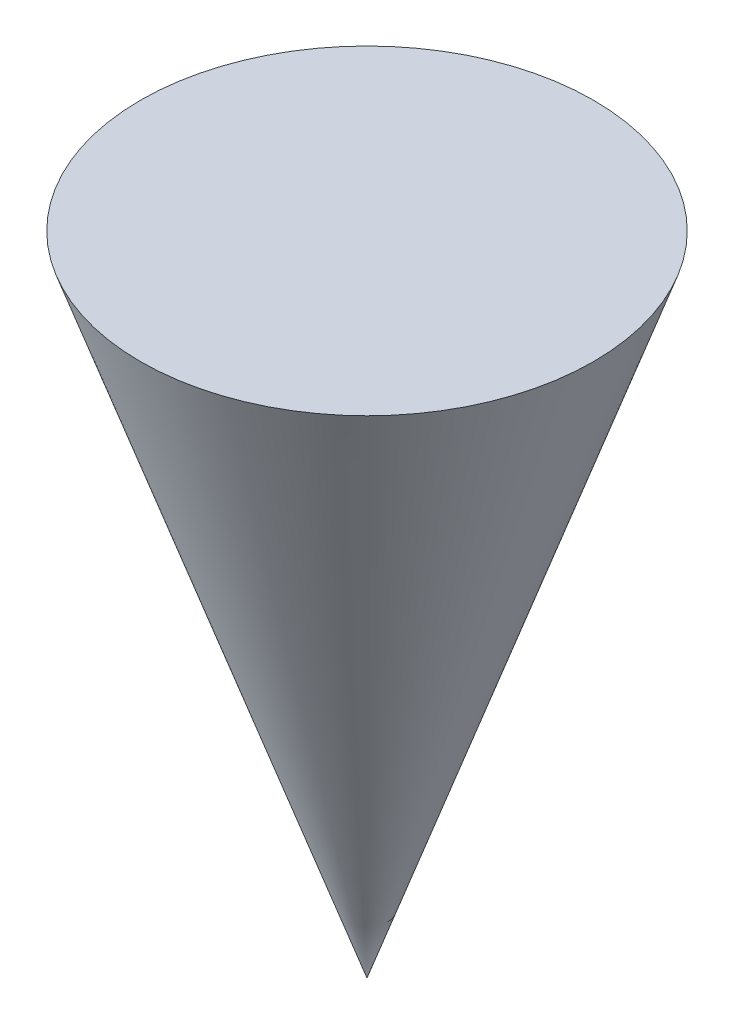
ISO-10303-21;
HEADER;
FILE_DESCRIPTION(('STEP AP214'),'2;1');
FILE_NAME('part.step','',(''),(''),'','','');
FILE_SCHEMA(('AUTOMOTIVE_DESIGN { 1 0 10303 214 1 1 1 1 }'));
ENDSEC;
DATA;
#1=APPLICATION_CONTEXT('core data for automotive mechanical design processes');
#2=APPLICATION_PROTOCOL_DEFINITION('international standard','automotive_design',2000,#1);
#3=PRODUCT_CONTEXT('',#1,'mechanical');
#4=PRODUCT('Part','Part','',(#3));
#5=PRODUCT_RELATED_PRODUCT_CATEGORY('part','',(#4));
#6=PRODUCT_DEFINITION_FORMATION('','',#4);
#7=PRODUCT_DEFINITION_CONTEXT('part definition',#1,'design');
#8=PRODUCT_DEFINITION('design','',#6,#7);
#9=PRODUCT_DEFINITION_SHAPE('','',#8);
#10=(LENGTH_UNIT() NAMED_UNIT(*) SI_UNIT(.MILLI.,.METRE.));
#11=(NAMED_UNIT(*) PLANE_ANGLE_UNIT() SI_UNIT($,.RADIAN.));
#12=(NAMED_UNIT(*) SI_UNIT($,.STERADIAN.) SOLID_ANGLE_UNIT());
#13=UNCERTAINTY_MEASURE_WITH_UNIT(LENGTH_MEASURE(1.E-05),#10,'distance_accuracy_value','');
#14=(GEOMETRIC_REPRESENTATION_CONTEXT(3) GLOBAL_UNCERTAINTY_ASSIGNED_CONTEXT((#13)) GLOBAL_UNIT_ASSIGNED_CONTEXT((#10,
#11,#12)) REPRESENTATION_CONTEXT('',''));
#15=CARTESIAN_POINT('',(0.,0.,0.));
#16=DIRECTION('',(0.,0.,1.));
#17=DIRECTION('',(1.,0.,0.));
#18=AXIS2_PLACEMENT_3D('',#15,#16,#17);
#19=CARTESIAN_POINT('',(0.,0.,0.));
#20=DIRECTION('',(0.,1.,0.));
#21=DIRECTION('',(0.,0.,1.));
#22=AXIS2_PLACEMENT_3D('',#19,#20,#21);
#23=CONICAL_SURFACE('',#22,0.,0.336674819386727);
#24=CARTESIAN_POINT('',(0.,20.,0.));
#25=DIRECTION('',(0.,-1.,0.));
#26=DIRECTION('',(0.,0.,-1.));
#27=AXIS2_PLACEMENT_3D('',#24,#25,#26);
#28=CIRCLE('',#27,7.);
#29=CARTESIAN_POINT('',(0.,20.,-7.));
#30=VERTEX_POINT('',#29);
#31=EDGE_CURVE('E11',#30,#30,#28,.T.);
#32=ORIENTED_EDGE('',*,*,#31,.T.);
#33=EDGE_LOOP('',(#32));
#34=FACE_BOUND('',#33,.T.);
#35=CARTESIAN_POINT('',(0.,0.,0.));
#36=VERTEX_POINT('',#35);
#37=VERTEX_LOOP('',#36);
#38=FACE_BOUND('',#37,.T.);
#39=ADVANCED_FACE('F43',(#34,#38),#23,.T.);
#40=CARTESIAN_POINT('',(0.,20.,0.));
#41=DIRECTION('',(0.,1.,0.));
#42=DIRECTION('',(0.,0.,1.));
#43=AXIS2_PLACEMENT_3D('',#40,#41,#42);
#44=PLANE('',#43);
#45=ORIENTED_EDGE('',*,*,#31,.F.);
#46=EDGE_LOOP('',(#45));
#47=FACE_BOUND('',#46,.T.);
#48=ADVANCED_FACE('F52',(#47),#44,.T.);
#49=CLOSED_SHELL('',(#39,#48));
#50=MANIFOLD_SOLID_BREP('B2',#49);
#51=ADVANCED_BREP_SHAPE_REPRESENTATION('',(#18,#50),#14);
#52=SHAPE_DEFINITION_REPRESENTATION(#9,#51);
ENDSEC;
END-ISO-10303-21;
